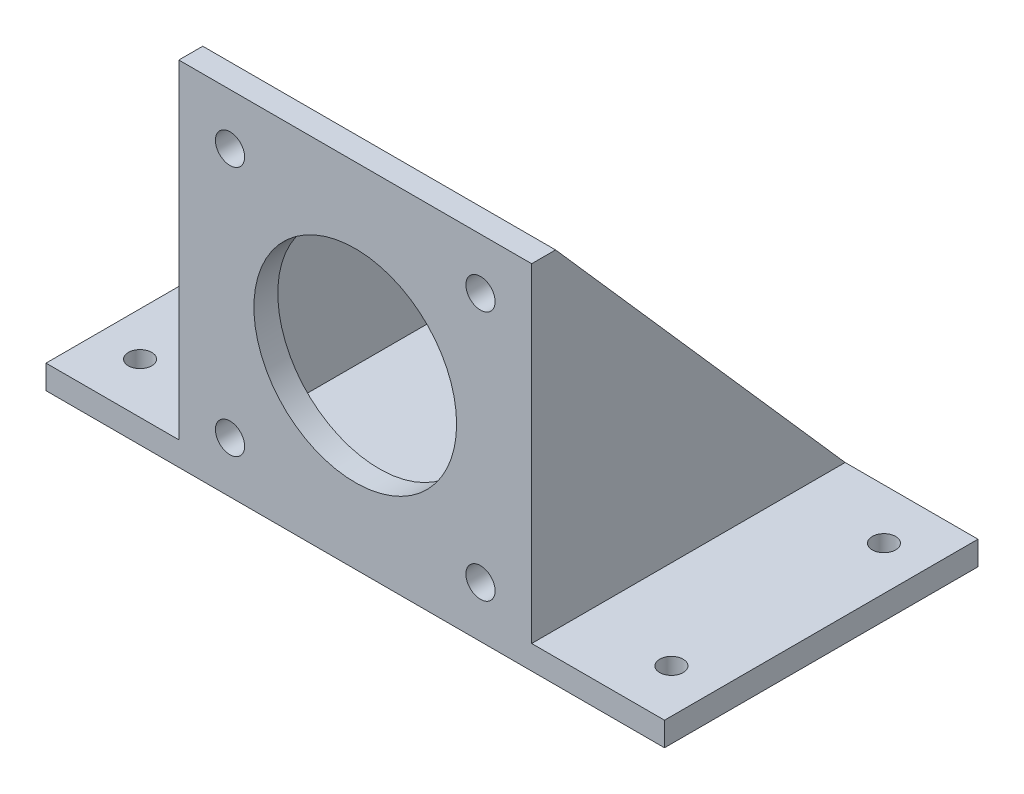
ISO-10303-21;
HEADER;
FILE_DESCRIPTION(('STEP AP214'),'2;1');
FILE_NAME('part.step','',(''),(''),'','','');
FILE_SCHEMA(('AUTOMOTIVE_DESIGN { 1 0 10303 214 1 1 1 1 }'));
ENDSEC;
DATA;
#1=APPLICATION_CONTEXT('core data for automotive mechanical design processes');
#2=APPLICATION_PROTOCOL_DEFINITION('international standard','automotive_design',2000,#1);
#3=PRODUCT_CONTEXT('',#1,'mechanical');
#4=PRODUCT('Part','Part','',(#3));
#5=PRODUCT_RELATED_PRODUCT_CATEGORY('part','',(#4));
#6=PRODUCT_DEFINITION_FORMATION('','',#4);
#7=PRODUCT_DEFINITION_CONTEXT('part definition',#1,'design');
#8=PRODUCT_DEFINITION('design','',#6,#7);
#9=PRODUCT_DEFINITION_SHAPE('','',#8);
#10=(LENGTH_UNIT() NAMED_UNIT(*) SI_UNIT(.MILLI.,.METRE.));
#11=(NAMED_UNIT(*) PLANE_ANGLE_UNIT() SI_UNIT($,.RADIAN.));
#12=(NAMED_UNIT(*) SI_UNIT($,.STERADIAN.) SOLID_ANGLE_UNIT());
#13=UNCERTAINTY_MEASURE_WITH_UNIT(LENGTH_MEASURE(1.E-05),#10,'distance_accuracy_value','');
#14=(GEOMETRIC_REPRESENTATION_CONTEXT(3) GLOBAL_UNCERTAINTY_ASSIGNED_CONTEXT((#13)) GLOBAL_UNIT_ASSIGNED_CONTEXT((#10,
#11,#12)) REPRESENTATION_CONTEXT('',''));
#15=CARTESIAN_POINT('',(0.,0.,0.));
#16=DIRECTION('',(0.,0.,1.));
#17=DIRECTION('',(1.,0.,0.));
#18=AXIS2_PLACEMENT_3D('',#15,#16,#17);
#19=CARTESIAN_POINT('',(0.,0.,59.));
#20=DIRECTION('',(1.,0.,0.));
#21=DIRECTION('',(0.,0.,-1.));
#22=AXIS2_PLACEMENT_3D('',#19,#20,#21);
#23=PLANE('',#22);
#24=DIRECTION('',(0.,-0.750545118423435,-0.66081920765876));
#25=VECTOR('',#24,1.);
#26=CARTESIAN_POINT('',(0.,66.4,54.5));
#27=LINE('',#26,#25);
#28=CARTESIAN_POINT('',(0.,66.4,54.5));
#29=VERTEX_POINT('',#28);
#30=CARTESIAN_POINT('',(0.,4.5,0.));
#31=VERTEX_POINT('',#30);
#32=EDGE_CURVE('E169',#29,#31,#27,.T.);
#33=ORIENTED_EDGE('',*,*,#32,.T.);
#34=DIRECTION('',(0.,0.,1.));
#35=VECTOR('',#34,1.);
#36=CARTESIAN_POINT('',(0.,4.5,59.));
#37=LINE('',#36,#35);
#38=CARTESIAN_POINT('',(0.,4.5,59.));
#39=VERTEX_POINT('',#38);
#40=EDGE_CURVE('E165',#31,#39,#37,.T.);
#41=ORIENTED_EDGE('',*,*,#40,.T.);
#42=DIRECTION('',(0.,-1.,0.));
#43=VECTOR('',#42,1.);
#44=CARTESIAN_POINT('',(0.,0.,59.));
#45=LINE('',#44,#43);
#46=CARTESIAN_POINT('',(0.,66.4,59.));
#47=VERTEX_POINT('',#46);
#48=EDGE_CURVE('E233',#47,#39,#45,.T.);
#49=ORIENTED_EDGE('',*,*,#48,.F.);
#50=DIRECTION('',(0.,0.,-1.));
#51=VECTOR('',#50,1.);
#52=CARTESIAN_POINT('',(0.,66.4,59.));
#53=LINE('',#52,#51);
#54=EDGE_CURVE('E40',#47,#29,#53,.T.);
#55=ORIENTED_EDGE('',*,*,#54,.T.);
#56=EDGE_LOOP('',(#33,#41,#49,#55));
#57=FACE_BOUND('',#56,.T.);
#58=ADVANCED_FACE('F32',(#57),#23,.F.);
#59=CARTESIAN_POINT('',(0.,0.,59.));
#60=DIRECTION('',(0.,1.,0.));
#61=DIRECTION('',(0.,0.,1.));
#62=AXIS2_PLACEMENT_3D('',#59,#60,#61);
#63=PLANE('',#62);
#64=CARTESIAN_POINT('',(83.2,0.,9.49999999999998));
#65=DIRECTION('',(0.,1.,0.));
#66=DIRECTION('',(0.,0.,1.));
#67=AXIS2_PLACEMENT_3D('',#64,#65,#66);
#68=CIRCLE('',#67,2.2);
#69=CARTESIAN_POINT('',(83.2,0.,11.7));
#70=VERTEX_POINT('',#69);
#71=EDGE_CURVE('E462',#70,#70,#68,.T.);
#72=ORIENTED_EDGE('',*,*,#71,.T.);
#73=EDGE_LOOP('',(#72));
#74=FACE_BOUND('',#73,.T.);
#75=CARTESIAN_POINT('',(83.2,0.,49.5));
#76=DIRECTION('',(0.,1.,0.));
#77=DIRECTION('',(0.,0.,1.));
#78=AXIS2_PLACEMENT_3D('',#75,#76,#77);
#79=CIRCLE('',#78,2.2);
#80=CARTESIAN_POINT('',(83.2,0.,51.7));
#81=VERTEX_POINT('',#80);
#82=EDGE_CURVE('E470',#81,#81,#79,.T.);
#83=ORIENTED_EDGE('',*,*,#82,.T.);
#84=EDGE_LOOP('',(#83));
#85=FACE_BOUND('',#84,.T.);
#86=CARTESIAN_POINT('',(-16.8,0.,49.5));
#87=DIRECTION('',(0.,1.,0.));
#88=DIRECTION('',(0.,0.,1.));
#89=AXIS2_PLACEMENT_3D('',#86,#87,#88);
#90=CIRCLE('',#89,2.2);
#91=CARTESIAN_POINT('',(-16.8,0.,51.7));
#92=VERTEX_POINT('',#91);
#93=EDGE_CURVE('E476',#92,#92,#90,.T.);
#94=ORIENTED_EDGE('',*,*,#93,.T.);
#95=EDGE_LOOP('',(#94));
#96=FACE_BOUND('',#95,.T.);
#97=CARTESIAN_POINT('',(-16.8,0.,9.49999999999998));
#98=DIRECTION('',(0.,1.,0.));
#99=DIRECTION('',(0.,0.,1.));
#100=AXIS2_PLACEMENT_3D('',#97,#98,#99);
#101=CIRCLE('',#100,2.2);
#102=CARTESIAN_POINT('',(-16.8,0.,11.7));
#103=VERTEX_POINT('',#102);
#104=EDGE_CURVE('E157',#103,#103,#101,.T.);
#105=ORIENTED_EDGE('',*,*,#104,.T.);
#106=EDGE_LOOP('',(#105));
#107=FACE_BOUND('',#106,.T.);
#108=DIRECTION('',(1.,0.,0.));
#109=VECTOR('',#108,1.);
#110=CARTESIAN_POINT('',(0.,0.,0.));
#111=LINE('',#110,#109);
#112=CARTESIAN_POINT('',(-25.,0.,0.));
#113=VERTEX_POINT('',#112);
#114=CARTESIAN_POINT('',(91.4,0.,0.));
#115=VERTEX_POINT('',#114);
#116=EDGE_CURVE('E232',#113,#115,#111,.T.);
#117=ORIENTED_EDGE('',*,*,#116,.T.);
#118=DIRECTION('',(0.,0.,1.));
#119=VECTOR('',#118,1.);
#120=CARTESIAN_POINT('',(91.4,0.,59.));
#121=LINE('',#120,#119);
#122=CARTESIAN_POINT('',(91.4,0.,59.));
#123=VERTEX_POINT('',#122);
#124=EDGE_CURVE('E146',#115,#123,#121,.T.);
#125=ORIENTED_EDGE('',*,*,#124,.T.);
#126=DIRECTION('',(1.,0.,0.));
#127=VECTOR('',#126,1.);
#128=CARTESIAN_POINT('',(0.,0.,59.));
#129=LINE('',#128,#127);
#130=CARTESIAN_POINT('',(-25.,0.,59.));
#131=VERTEX_POINT('',#130);
#132=EDGE_CURVE('E122',#131,#123,#129,.T.);
#133=ORIENTED_EDGE('',*,*,#132,.F.);
#134=DIRECTION('',(0.,0.,-1.));
#135=VECTOR('',#134,1.);
#136=CARTESIAN_POINT('',(-25.,0.,59.));
#137=LINE('',#136,#135);
#138=EDGE_CURVE('E143',#131,#113,#137,.T.);
#139=ORIENTED_EDGE('',*,*,#138,.T.);
#140=EDGE_LOOP('',(#117,#125,#133,#139));
#141=FACE_BOUND('',#140,.T.);
#142=ADVANCED_FACE('F285',(#74,#85,#96,#107,#141),#63,.F.);
#143=CARTESIAN_POINT('',(66.4,0.,59.));
#144=DIRECTION('',(-1.,0.,0.));
#145=DIRECTION('',(0.,-1.,0.));
#146=AXIS2_PLACEMENT_3D('',#143,#144,#145);
#147=PLANE('',#146);
#148=DIRECTION('',(0.,1.,0.));
#149=VECTOR('',#148,1.);
#150=CARTESIAN_POINT('',(66.4,0.,59.));
#151=LINE('',#150,#149);
#152=CARTESIAN_POINT('',(66.4,4.5,59.));
#153=VERTEX_POINT('',#152);
#154=CARTESIAN_POINT('',(66.4,66.4,59.));
#155=VERTEX_POINT('',#154);
#156=EDGE_CURVE('E47',#153,#155,#151,.T.);
#157=ORIENTED_EDGE('',*,*,#156,.F.);
#158=DIRECTION('',(0.,0.,-1.));
#159=VECTOR('',#158,1.);
#160=CARTESIAN_POINT('',(66.4,4.5,59.));
#161=LINE('',#160,#159);
#162=CARTESIAN_POINT('',(66.4,4.50000000000002,0.));
#163=VERTEX_POINT('',#162);
#164=EDGE_CURVE('E135',#153,#163,#161,.T.);
#165=ORIENTED_EDGE('',*,*,#164,.T.);
#166=DIRECTION('',(0.,-0.750545118423435,-0.66081920765876));
#167=VECTOR('',#166,1.);
#168=CARTESIAN_POINT('',(66.4,66.4,54.5));
#169=LINE('',#168,#167);
#170=CARTESIAN_POINT('',(66.4,66.4,54.5));
#171=VERTEX_POINT('',#170);
#172=EDGE_CURVE('E168',#171,#163,#169,.T.);
#173=ORIENTED_EDGE('',*,*,#172,.F.);
#174=DIRECTION('',(0.,0.,-1.));
#175=VECTOR('',#174,1.);
#176=CARTESIAN_POINT('',(66.4,66.4,59.));
#177=LINE('',#176,#175);
#178=EDGE_CURVE('E11',#155,#171,#177,.T.);
#179=ORIENTED_EDGE('',*,*,#178,.F.);
#180=EDGE_LOOP('',(#157,#165,#173,#179));
#181=FACE_BOUND('',#180,.T.);
#182=ADVANCED_FACE('F272',(#181),#147,.F.);
#183=CARTESIAN_POINT('',(0.,66.4,59.));
#184=DIRECTION('',(0.,-1.,0.));
#185=DIRECTION('',(1.,0.,0.));
#186=AXIS2_PLACEMENT_3D('',#183,#184,#185);
#187=PLANE('',#186);
#188=ORIENTED_EDGE('',*,*,#178,.T.);
#189=DIRECTION('',(1.,0.,0.));
#190=VECTOR('',#189,1.);
#191=CARTESIAN_POINT('',(0.,66.4,54.5));
#192=LINE('',#191,#190);
#193=CARTESIAN_POINT('',(61.9,66.4,54.5));
#194=VERTEX_POINT('',#193);
#195=EDGE_CURVE('E176',#194,#171,#192,.T.);
#196=ORIENTED_EDGE('',*,*,#195,.F.);
#197=DIRECTION('',(1.,0.,0.));
#198=VECTOR('',#197,1.);
#199=CARTESIAN_POINT('',(61.9,66.4,54.5));
#200=LINE('',#199,#198);
#201=CARTESIAN_POINT('',(4.5,66.4,54.5));
#202=VERTEX_POINT('',#201);
#203=EDGE_CURVE('E184',#202,#194,#200,.T.);
#204=ORIENTED_EDGE('',*,*,#203,.F.);
#205=EDGE_CURVE('E173',#29,#202,#192,.T.);
#206=ORIENTED_EDGE('',*,*,#205,.F.);
#207=ORIENTED_EDGE('',*,*,#54,.F.);
#208=DIRECTION('',(-1.,0.,0.));
#209=VECTOR('',#208,1.);
#210=CARTESIAN_POINT('',(0.,66.4,59.));
#211=LINE('',#210,#209);
#212=EDGE_CURVE('E237',#155,#47,#211,.T.);
#213=ORIENTED_EDGE('',*,*,#212,.F.);
#214=EDGE_LOOP('',(#188,#196,#204,#206,#207,#213));
#215=FACE_BOUND('',#214,.T.);
#216=ADVANCED_FACE('F247',(#215),#187,.F.);
#217=CARTESIAN_POINT('',(0.,0.,59.));
#218=DIRECTION('',(0.,0.,-1.));
#219=DIRECTION('',(-1.,0.,0.));
#220=AXIS2_PLACEMENT_3D('',#217,#218,#219);
#221=PLANE('',#220);
#222=CARTESIAN_POINT('',(9.62999999999999,9.63,59.));
#223=DIRECTION('',(0.,0.,1.));
#224=DIRECTION('',(1.,0.,0.));
#225=AXIS2_PLACEMENT_3D('',#222,#223,#224);
#226=CIRCLE('',#225,2.75);
#227=CARTESIAN_POINT('',(12.38,9.63,59.));
#228=VERTEX_POINT('',#227);
#229=EDGE_CURVE('E217',#228,#228,#226,.T.);
#230=ORIENTED_EDGE('',*,*,#229,.F.);
#231=EDGE_LOOP('',(#230));
#232=FACE_BOUND('',#231,.T.);
#233=CARTESIAN_POINT('',(56.77,9.63,59.));
#234=DIRECTION('',(0.,0.,1.));
#235=DIRECTION('',(1.,0.,0.));
#236=AXIS2_PLACEMENT_3D('',#233,#234,#235);
#237=CIRCLE('',#236,2.75);
#238=CARTESIAN_POINT('',(59.52,9.63,59.));
#239=VERTEX_POINT('',#238);
#240=EDGE_CURVE('E220',#239,#239,#237,.T.);
#241=ORIENTED_EDGE('',*,*,#240,.F.);
#242=EDGE_LOOP('',(#241));
#243=FACE_BOUND('',#242,.T.);
#244=CARTESIAN_POINT('',(56.77,56.77,59.));
#245=DIRECTION('',(0.,0.,1.));
#246=DIRECTION('',(1.,0.,0.));
#247=AXIS2_PLACEMENT_3D('',#244,#245,#246);
#248=CIRCLE('',#247,2.75);
#249=CARTESIAN_POINT('',(59.52,56.77,59.));
#250=VERTEX_POINT('',#249);
#251=EDGE_CURVE('E223',#250,#250,#248,.T.);
#252=ORIENTED_EDGE('',*,*,#251,.F.);
#253=EDGE_LOOP('',(#252));
#254=FACE_BOUND('',#253,.T.);
#255=CARTESIAN_POINT('',(9.62999999999999,56.77,59.));
#256=DIRECTION('',(0.,0.,1.));
#257=DIRECTION('',(1.,0.,0.));
#258=AXIS2_PLACEMENT_3D('',#255,#256,#257);
#259=CIRCLE('',#258,2.75);
#260=CARTESIAN_POINT('',(12.38,56.77,59.));
#261=VERTEX_POINT('',#260);
#262=EDGE_CURVE('E226',#261,#261,#259,.T.);
#263=ORIENTED_EDGE('',*,*,#262,.F.);
#264=EDGE_LOOP('',(#263));
#265=FACE_BOUND('',#264,.T.);
#266=CARTESIAN_POINT('',(33.2,33.2,59.));
#267=DIRECTION('',(0.,0.,1.));
#268=DIRECTION('',(1.,0.,0.));
#269=AXIS2_PLACEMENT_3D('',#266,#267,#268);
#270=CIRCLE('',#269,19.075);
#271=CARTESIAN_POINT('',(52.275,33.2,59.));
#272=VERTEX_POINT('',#271);
#273=EDGE_CURVE('E229',#272,#272,#270,.T.);
#274=ORIENTED_EDGE('',*,*,#273,.F.);
#275=EDGE_LOOP('',(#274));
#276=FACE_BOUND('',#275,.T.);
#277=ORIENTED_EDGE('',*,*,#48,.T.);
#278=DIRECTION('',(-1.,0.,0.));
#279=VECTOR('',#278,1.);
#280=CARTESIAN_POINT('',(91.4,4.5,59.));
#281=LINE('',#280,#279);
#282=CARTESIAN_POINT('',(-25.,4.5,59.));
#283=VERTEX_POINT('',#282);
#284=EDGE_CURVE('E137',#39,#283,#281,.T.);
#285=ORIENTED_EDGE('',*,*,#284,.T.);
#286=DIRECTION('',(0.,-1.,0.));
#287=VECTOR('',#286,1.);
#288=CARTESIAN_POINT('',(-25.,4.5,59.));
#289=LINE('',#288,#287);
#290=EDGE_CURVE('E127',#283,#131,#289,.T.);
#291=ORIENTED_EDGE('',*,*,#290,.T.);
#292=ORIENTED_EDGE('',*,*,#132,.T.);
#293=DIRECTION('',(0.,-1.,0.));
#294=VECTOR('',#293,1.);
#295=CARTESIAN_POINT('',(91.4,4.5,59.));
#296=LINE('',#295,#294);
#297=CARTESIAN_POINT('',(91.4,4.5,59.));
#298=VERTEX_POINT('',#297);
#299=EDGE_CURVE('E116',#298,#123,#296,.T.);
#300=ORIENTED_EDGE('',*,*,#299,.F.);
#301=EDGE_CURVE('E120',#298,#153,#281,.T.);
#302=ORIENTED_EDGE('',*,*,#301,.T.);
#303=ORIENTED_EDGE('',*,*,#156,.T.);
#304=ORIENTED_EDGE('',*,*,#212,.T.);
#305=EDGE_LOOP('',(#277,#285,#291,#292,#300,#302,#303,#304));
#306=FACE_BOUND('',#305,.T.);
#307=ADVANCED_FACE('F119',(#232,#243,#254,#265,#276,#306),#221,.F.);
#308=CARTESIAN_POINT('',(0.,0.,0.));
#309=DIRECTION('',(0.,0.,-1.));
#310=DIRECTION('',(-1.,0.,0.));
#311=AXIS2_PLACEMENT_3D('',#308,#309,#310);
#312=PLANE('',#311);
#313=DIRECTION('',(1.,0.,0.));
#314=VECTOR('',#313,1.);
#315=CARTESIAN_POINT('',(0.,4.50000000000001,0.));
#316=LINE('',#315,#314);
#317=CARTESIAN_POINT('',(61.9,4.50000000000002,0.));
#318=VERTEX_POINT('',#317);
#319=EDGE_CURVE('E55',#318,#163,#316,.T.);
#320=ORIENTED_EDGE('',*,*,#319,.T.);
#321=DIRECTION('',(1.,0.,0.));
#322=VECTOR('',#321,1.);
#323=CARTESIAN_POINT('',(91.4,4.5,0.));
#324=LINE('',#323,#322);
#325=CARTESIAN_POINT('',(91.4,4.5,0.));
#326=VERTEX_POINT('',#325);
#327=EDGE_CURVE('E154',#163,#326,#324,.T.);
#328=ORIENTED_EDGE('',*,*,#327,.T.);
#329=DIRECTION('',(0.,-1.,0.));
#330=VECTOR('',#329,1.);
#331=CARTESIAN_POINT('',(91.4,4.5,0.));
#332=LINE('',#331,#330);
#333=EDGE_CURVE('E142',#326,#115,#332,.T.);
#334=ORIENTED_EDGE('',*,*,#333,.T.);
#335=ORIENTED_EDGE('',*,*,#116,.F.);
#336=DIRECTION('',(0.,-1.,0.));
#337=VECTOR('',#336,1.);
#338=CARTESIAN_POINT('',(-25.,4.5,0.));
#339=LINE('',#338,#337);
#340=CARTESIAN_POINT('',(-25.,4.5,0.));
#341=VERTEX_POINT('',#340);
#342=EDGE_CURVE('E160',#341,#113,#339,.T.);
#343=ORIENTED_EDGE('',*,*,#342,.F.);
#344=EDGE_CURVE('E128',#341,#31,#324,.T.);
#345=ORIENTED_EDGE('',*,*,#344,.T.);
#346=CARTESIAN_POINT('',(4.50000000000001,4.50000000000001,0.));
#347=VERTEX_POINT('',#346);
#348=EDGE_CURVE('E177',#31,#347,#316,.T.);
#349=ORIENTED_EDGE('',*,*,#348,.T.);
#350=DIRECTION('',(-1.,0.,0.));
#351=VECTOR('',#350,1.);
#352=CARTESIAN_POINT('',(4.50000000000001,4.5,0.));
#353=LINE('',#352,#351);
#354=EDGE_CURVE('E191',#318,#347,#353,.T.);
#355=ORIENTED_EDGE('',*,*,#354,.F.);
#356=EDGE_LOOP('',(#320,#328,#334,#335,#343,#345,#349,#355));
#357=FACE_BOUND('',#356,.T.);
#358=ADVANCED_FACE('F265',(#357),#312,.T.);
#359=CARTESIAN_POINT('',(33.2,33.2,0.));
#360=DIRECTION('',(0.,0.,1.));
#361=DIRECTION('',(1.,0.,0.));
#362=AXIS2_PLACEMENT_3D('',#359,#360,#361);
#363=CYLINDRICAL_SURFACE('',#362,19.075);
#364=CARTESIAN_POINT('',(33.2,33.2,54.5));
#365=DIRECTION('',(0.,0.,1.));
#366=DIRECTION('',(1.,0.,0.));
#367=AXIS2_PLACEMENT_3D('',#364,#365,#366);
#368=CIRCLE('',#367,19.075);
#369=CARTESIAN_POINT('',(52.275,33.2,54.5));
#370=VERTEX_POINT('',#369);
#371=EDGE_CURVE('E214',#370,#370,#368,.F.);
#372=ORIENTED_EDGE('',*,*,#371,.T.);
#373=EDGE_LOOP('',(#372));
#374=FACE_BOUND('',#373,.T.);
#375=ORIENTED_EDGE('',*,*,#273,.T.);
#376=EDGE_LOOP('',(#375));
#377=FACE_BOUND('',#376,.T.);
#378=ADVANCED_FACE('F301',(#374,#377),#363,.F.);
#379=CARTESIAN_POINT('',(9.62999999999999,56.77,0.));
#380=DIRECTION('',(0.,0.,1.));
#381=DIRECTION('',(1.,0.,0.));
#382=AXIS2_PLACEMENT_3D('',#379,#380,#381);
#383=CYLINDRICAL_SURFACE('',#382,2.75);
#384=CARTESIAN_POINT('',(9.62999999999999,56.77,54.5));
#385=DIRECTION('',(0.,0.,1.));
#386=DIRECTION('',(1.,0.,0.));
#387=AXIS2_PLACEMENT_3D('',#384,#385,#386);
#388=CIRCLE('',#387,2.75);
#389=CARTESIAN_POINT('',(12.38,56.77,54.5));
#390=VERTEX_POINT('',#389);
#391=EDGE_CURVE('E211',#390,#390,#388,.F.);
#392=ORIENTED_EDGE('',*,*,#391,.T.);
#393=EDGE_LOOP('',(#392));
#394=FACE_BOUND('',#393,.T.);
#395=ORIENTED_EDGE('',*,*,#262,.T.);
#396=EDGE_LOOP('',(#395));
#397=FACE_BOUND('',#396,.T.);
#398=ADVANCED_FACE('F307',(#394,#397),#383,.F.);
#399=CARTESIAN_POINT('',(56.77,56.77,0.));
#400=DIRECTION('',(0.,0.,1.));
#401=DIRECTION('',(1.,0.,0.));
#402=AXIS2_PLACEMENT_3D('',#399,#400,#401);
#403=CYLINDRICAL_SURFACE('',#402,2.75);
#404=CARTESIAN_POINT('',(56.77,56.77,54.5));
#405=DIRECTION('',(0.,0.,1.));
#406=DIRECTION('',(1.,0.,0.));
#407=AXIS2_PLACEMENT_3D('',#404,#405,#406);
#408=CIRCLE('',#407,2.75);
#409=CARTESIAN_POINT('',(59.52,56.77,54.5));
#410=VERTEX_POINT('',#409);
#411=EDGE_CURVE('E208',#410,#410,#408,.F.);
#412=ORIENTED_EDGE('',*,*,#411,.T.);
#413=EDGE_LOOP('',(#412));
#414=FACE_BOUND('',#413,.T.);
#415=ORIENTED_EDGE('',*,*,#251,.T.);
#416=EDGE_LOOP('',(#415));
#417=FACE_BOUND('',#416,.T.);
#418=ADVANCED_FACE('F311',(#414,#417),#403,.F.);
#419=CARTESIAN_POINT('',(56.77,9.63,0.));
#420=DIRECTION('',(0.,0.,1.));
#421=DIRECTION('',(1.,0.,0.));
#422=AXIS2_PLACEMENT_3D('',#419,#420,#421);
#423=CYLINDRICAL_SURFACE('',#422,2.75);
#424=CARTESIAN_POINT('',(56.77,9.63,54.5));
#425=DIRECTION('',(0.,0.,1.));
#426=DIRECTION('',(1.,0.,0.));
#427=AXIS2_PLACEMENT_3D('',#424,#425,#426);
#428=CIRCLE('',#427,2.75);
#429=CARTESIAN_POINT('',(59.52,9.63,54.5));
#430=VERTEX_POINT('',#429);
#431=EDGE_CURVE('E205',#430,#430,#428,.F.);
#432=ORIENTED_EDGE('',*,*,#431,.T.);
#433=EDGE_LOOP('',(#432));
#434=FACE_BOUND('',#433,.T.);
#435=ORIENTED_EDGE('',*,*,#240,.T.);
#436=EDGE_LOOP('',(#435));
#437=FACE_BOUND('',#436,.T.);
#438=ADVANCED_FACE('F315',(#434,#437),#423,.F.);
#439=CARTESIAN_POINT('',(9.62999999999999,9.63,0.));
#440=DIRECTION('',(0.,0.,1.));
#441=DIRECTION('',(1.,0.,0.));
#442=AXIS2_PLACEMENT_3D('',#439,#440,#441);
#443=CYLINDRICAL_SURFACE('',#442,2.75);
#444=CARTESIAN_POINT('',(9.62999999999999,9.63,54.5));
#445=DIRECTION('',(0.,0.,1.));
#446=DIRECTION('',(1.,0.,0.));
#447=AXIS2_PLACEMENT_3D('',#444,#445,#446);
#448=CIRCLE('',#447,2.75);
#449=CARTESIAN_POINT('',(12.38,9.63,54.5));
#450=VERTEX_POINT('',#449);
#451=EDGE_CURVE('E35',#450,#450,#448,.F.);
#452=ORIENTED_EDGE('',*,*,#451,.T.);
#453=EDGE_LOOP('',(#452));
#454=FACE_BOUND('',#453,.T.);
#455=ORIENTED_EDGE('',*,*,#229,.T.);
#456=EDGE_LOOP('',(#455));
#457=FACE_BOUND('',#456,.T.);
#458=ADVANCED_FACE('F319',(#454,#457),#443,.F.);
#459=CARTESIAN_POINT('',(61.9,4.50000000000002,54.5));
#460=DIRECTION('',(0.,0.,1.));
#461=DIRECTION('',(1.,0.,0.));
#462=AXIS2_PLACEMENT_3D('',#459,#460,#461);
#463=PLANE('',#462);
#464=ORIENTED_EDGE('',*,*,#391,.F.);
#465=EDGE_LOOP('',(#464));
#466=FACE_BOUND('',#465,.T.);
#467=ORIENTED_EDGE('',*,*,#431,.F.);
#468=EDGE_LOOP('',(#467));
#469=FACE_BOUND('',#468,.T.);
#470=ORIENTED_EDGE('',*,*,#203,.T.);
#471=DIRECTION('',(0.,1.,0.));
#472=VECTOR('',#471,1.);
#473=CARTESIAN_POINT('',(61.9,4.50000000000002,54.5));
#474=LINE('',#473,#472);
#475=CARTESIAN_POINT('',(61.9,4.50000000000002,54.5));
#476=VERTEX_POINT('',#475);
#477=EDGE_CURVE('E197',#476,#194,#474,.T.);
#478=ORIENTED_EDGE('',*,*,#477,.F.);
#479=DIRECTION('',(1.,0.,0.));
#480=VECTOR('',#479,1.);
#481=CARTESIAN_POINT('',(61.9,4.50000000000002,54.5));
#482=LINE('',#481,#480);
#483=CARTESIAN_POINT('',(4.50000000000001,4.5,54.5));
#484=VERTEX_POINT('',#483);
#485=EDGE_CURVE('E185',#484,#476,#482,.T.);
#486=ORIENTED_EDGE('',*,*,#485,.F.);
#487=DIRECTION('',(0.,1.,0.));
#488=VECTOR('',#487,1.);
#489=CARTESIAN_POINT('',(4.50000000000001,4.5,54.5));
#490=LINE('',#489,#488);
#491=EDGE_CURVE('E200',#484,#202,#490,.T.);
#492=ORIENTED_EDGE('',*,*,#491,.T.);
#493=EDGE_LOOP('',(#470,#478,#486,#492));
#494=FACE_BOUND('',#493,.T.);
#495=ORIENTED_EDGE('',*,*,#451,.F.);
#496=EDGE_LOOP('',(#495));
#497=FACE_BOUND('',#496,.T.);
#498=ORIENTED_EDGE('',*,*,#411,.F.);
#499=EDGE_LOOP('',(#498));
#500=FACE_BOUND('',#499,.T.);
#501=ORIENTED_EDGE('',*,*,#371,.F.);
#502=EDGE_LOOP('',(#501));
#503=FACE_BOUND('',#502,.T.);
#504=ADVANCED_FACE('F258',(#466,#469,#494,#497,#500,#503),#463,.F.);
#505=CARTESIAN_POINT('',(4.50000000000001,4.5,54.5));
#506=DIRECTION('',(-1.,0.,0.));
#507=DIRECTION('',(0.,-1.,0.));
#508=AXIS2_PLACEMENT_3D('',#505,#506,#507);
#509=PLANE('',#508);
#510=DIRECTION('',(0.,0.,1.));
#511=VECTOR('',#510,1.);
#512=CARTESIAN_POINT('',(4.50000000000001,4.5,54.5));
#513=LINE('',#512,#511);
#514=EDGE_CURVE('E194',#347,#484,#513,.T.);
#515=ORIENTED_EDGE('',*,*,#514,.F.);
#516=DIRECTION('',(0.,0.750545118423436,0.66081920765876));
#517=VECTOR('',#516,1.);
#518=CARTESIAN_POINT('',(4.50000000000001,31.5306173605455,23.7991703739859));
#519=LINE('',#518,#517);
#520=EDGE_CURVE('E181',#347,#202,#519,.T.);
#521=ORIENTED_EDGE('',*,*,#520,.T.);
#522=ORIENTED_EDGE('',*,*,#491,.F.);
#523=EDGE_LOOP('',(#515,#521,#522));
#524=FACE_BOUND('',#523,.T.);
#525=ADVANCED_FACE('F255',(#524),#509,.F.);
#526=CARTESIAN_POINT('',(61.9,4.50000000000002,54.5));
#527=DIRECTION('',(1.,0.,0.));
#528=DIRECTION('',(0.,1.,0.));
#529=AXIS2_PLACEMENT_3D('',#526,#527,#528);
#530=PLANE('',#529);
#531=ORIENTED_EDGE('',*,*,#477,.T.);
#532=DIRECTION('',(0.,-0.750545118423436,-0.66081920765876));
#533=VECTOR('',#532,1.);
#534=CARTESIAN_POINT('',(61.9,31.5306173605455,23.7991703739859));
#535=LINE('',#534,#533);
#536=EDGE_CURVE('E175',#194,#318,#535,.T.);
#537=ORIENTED_EDGE('',*,*,#536,.T.);
#538=DIRECTION('',(0.,0.,-1.));
#539=VECTOR('',#538,1.);
#540=CARTESIAN_POINT('',(61.9,4.50000000000002,54.5));
#541=LINE('',#540,#539);
#542=EDGE_CURVE('E188',#476,#318,#541,.T.);
#543=ORIENTED_EDGE('',*,*,#542,.F.);
#544=EDGE_LOOP('',(#531,#537,#543));
#545=FACE_BOUND('',#544,.T.);
#546=ADVANCED_FACE('F274',(#545),#530,.F.);
#547=CARTESIAN_POINT('',(0.,4.5,0.));
#548=DIRECTION('',(0.,-1.,0.));
#549=DIRECTION('',(1.,0.,0.));
#550=AXIS2_PLACEMENT_3D('',#547,#548,#549);
#551=PLANE('',#550);
#552=ORIENTED_EDGE('',*,*,#485,.T.);
#553=ORIENTED_EDGE('',*,*,#542,.T.);
#554=ORIENTED_EDGE('',*,*,#354,.T.);
#555=ORIENTED_EDGE('',*,*,#514,.T.);
#556=EDGE_LOOP('',(#552,#553,#554,#555));
#557=FACE_BOUND('',#556,.T.);
#558=ADVANCED_FACE('F262',(#557),#551,.F.);
#559=CARTESIAN_POINT('',(0.,66.4,54.5));
#560=DIRECTION('',(0.,-0.66081920765876,0.750545118423436));
#561=DIRECTION('',(0.,-0.750545118423436,-0.66081920765876));
#562=AXIS2_PLACEMENT_3D('',#559,#560,#561);
#563=PLANE('',#562);
#564=ORIENTED_EDGE('',*,*,#195,.T.);
#565=ORIENTED_EDGE('',*,*,#172,.T.);
#566=ORIENTED_EDGE('',*,*,#319,.F.);
#567=ORIENTED_EDGE('',*,*,#536,.F.);
#568=EDGE_LOOP('',(#564,#565,#566,#567));
#569=FACE_BOUND('',#568,.T.);
#570=ADVANCED_FACE('F275',(#569),#563,.F.);
#571=ORIENTED_EDGE('',*,*,#348,.F.);
#572=ORIENTED_EDGE('',*,*,#32,.F.);
#573=ORIENTED_EDGE('',*,*,#205,.T.);
#574=ORIENTED_EDGE('',*,*,#520,.F.);
#575=EDGE_LOOP('',(#571,#572,#573,#574));
#576=FACE_BOUND('',#575,.T.);
#577=ADVANCED_FACE('F252',(#576),#563,.F.);
#578=CARTESIAN_POINT('',(91.4,4.5,59.));
#579=DIRECTION('',(1.,0.,0.));
#580=DIRECTION('',(0.,0.,-1.));
#581=AXIS2_PLACEMENT_3D('',#578,#579,#580);
#582=PLANE('',#581);
#583=ORIENTED_EDGE('',*,*,#124,.F.);
#584=ORIENTED_EDGE('',*,*,#333,.F.);
#585=DIRECTION('',(0.,0.,1.));
#586=VECTOR('',#585,1.);
#587=CARTESIAN_POINT('',(91.4,4.5,59.));
#588=LINE('',#587,#586);
#589=EDGE_CURVE('E134',#326,#298,#588,.T.);
#590=ORIENTED_EDGE('',*,*,#589,.T.);
#591=ORIENTED_EDGE('',*,*,#299,.T.);
#592=EDGE_LOOP('',(#583,#584,#590,#591));
#593=FACE_BOUND('',#592,.T.);
#594=ADVANCED_FACE('F140',(#593),#582,.T.);
#595=CARTESIAN_POINT('',(0.,4.5,0.));
#596=DIRECTION('',(0.,1.,0.));
#597=DIRECTION('',(0.,0.,1.));
#598=AXIS2_PLACEMENT_3D('',#595,#596,#597);
#599=PLANE('',#598);
#600=CARTESIAN_POINT('',(83.2,4.5,9.49999999999998));
#601=DIRECTION('',(0.,1.,0.));
#602=DIRECTION('',(0.,0.,1.));
#603=AXIS2_PLACEMENT_3D('',#600,#601,#602);
#604=CIRCLE('',#603,2.2);
#605=CARTESIAN_POINT('',(83.2,4.5,11.7));
#606=VERTEX_POINT('',#605);
#607=EDGE_CURVE('E465',#606,#606,#604,.T.);
#608=ORIENTED_EDGE('',*,*,#607,.F.);
#609=EDGE_LOOP('',(#608));
#610=FACE_BOUND('',#609,.T.);
#611=CARTESIAN_POINT('',(83.2,4.5,49.5));
#612=DIRECTION('',(0.,1.,0.));
#613=DIRECTION('',(0.,0.,1.));
#614=AXIS2_PLACEMENT_3D('',#611,#612,#613);
#615=CIRCLE('',#614,2.2);
#616=CARTESIAN_POINT('',(83.2,4.5,51.7));
#617=VERTEX_POINT('',#616);
#618=EDGE_CURVE('E467',#617,#617,#615,.T.);
#619=ORIENTED_EDGE('',*,*,#618,.F.);
#620=EDGE_LOOP('',(#619));
#621=FACE_BOUND('',#620,.T.);
#622=ORIENTED_EDGE('',*,*,#164,.F.);
#623=ORIENTED_EDGE('',*,*,#301,.F.);
#624=ORIENTED_EDGE('',*,*,#589,.F.);
#625=ORIENTED_EDGE('',*,*,#327,.F.);
#626=EDGE_LOOP('',(#622,#623,#624,#625));
#627=FACE_BOUND('',#626,.T.);
#628=ADVANCED_FACE('F132',(#610,#621,#627),#599,.T.);
#629=CARTESIAN_POINT('',(-16.8,4.5,49.5));
#630=DIRECTION('',(0.,1.,0.));
#631=DIRECTION('',(0.,0.,1.));
#632=AXIS2_PLACEMENT_3D('',#629,#630,#631);
#633=CIRCLE('',#632,2.2);
#634=CARTESIAN_POINT('',(-16.8,4.5,51.7));
#635=VERTEX_POINT('',#634);
#636=EDGE_CURVE('E473',#635,#635,#633,.T.);
#637=ORIENTED_EDGE('',*,*,#636,.F.);
#638=EDGE_LOOP('',(#637));
#639=FACE_BOUND('',#638,.T.);
#640=CARTESIAN_POINT('',(-16.8,4.5,9.49999999999998));
#641=DIRECTION('',(0.,1.,0.));
#642=DIRECTION('',(0.,0.,1.));
#643=AXIS2_PLACEMENT_3D('',#640,#641,#642);
#644=CIRCLE('',#643,2.2);
#645=CARTESIAN_POINT('',(-16.8,4.5,11.7));
#646=VERTEX_POINT('',#645);
#647=EDGE_CURVE('E149',#646,#646,#644,.T.);
#648=ORIENTED_EDGE('',*,*,#647,.F.);
#649=EDGE_LOOP('',(#648));
#650=FACE_BOUND('',#649,.T.);
#651=ORIENTED_EDGE('',*,*,#40,.F.);
#652=ORIENTED_EDGE('',*,*,#344,.F.);
#653=DIRECTION('',(0.,0.,-1.));
#654=VECTOR('',#653,1.);
#655=CARTESIAN_POINT('',(-25.,4.5,59.));
#656=LINE('',#655,#654);
#657=EDGE_CURVE('E136',#283,#341,#656,.T.);
#658=ORIENTED_EDGE('',*,*,#657,.F.);
#659=ORIENTED_EDGE('',*,*,#284,.F.);
#660=EDGE_LOOP('',(#651,#652,#658,#659));
#661=FACE_BOUND('',#660,.T.);
#662=ADVANCED_FACE('F269',(#639,#650,#661),#599,.T.);
#663=CARTESIAN_POINT('',(-25.,4.5,59.));
#664=DIRECTION('',(-1.,0.,0.));
#665=DIRECTION('',(0.,0.,1.));
#666=AXIS2_PLACEMENT_3D('',#663,#664,#665);
#667=PLANE('',#666);
#668=ORIENTED_EDGE('',*,*,#138,.F.);
#669=ORIENTED_EDGE('',*,*,#290,.F.);
#670=ORIENTED_EDGE('',*,*,#657,.T.);
#671=ORIENTED_EDGE('',*,*,#342,.T.);
#672=EDGE_LOOP('',(#668,#669,#670,#671));
#673=FACE_BOUND('',#672,.T.);
#674=ADVANCED_FACE('F393',(#673),#667,.T.);
#675=CARTESIAN_POINT('',(-16.8,0.,9.49999999999998));
#676=DIRECTION('',(0.,1.,0.));
#677=DIRECTION('',(0.,0.,1.));
#678=AXIS2_PLACEMENT_3D('',#675,#676,#677);
#679=CYLINDRICAL_SURFACE('',#678,2.2);
#680=ORIENTED_EDGE('',*,*,#104,.F.);
#681=EDGE_LOOP('',(#680));
#682=FACE_BOUND('',#681,.T.);
#683=ORIENTED_EDGE('',*,*,#647,.T.);
#684=EDGE_LOOP('',(#683));
#685=FACE_BOUND('',#684,.T.);
#686=ADVANCED_FACE('F397',(#682,#685),#679,.F.);
#687=CARTESIAN_POINT('',(-16.8,0.,49.5));
#688=DIRECTION('',(0.,1.,0.));
#689=DIRECTION('',(0.,0.,1.));
#690=AXIS2_PLACEMENT_3D('',#687,#688,#689);
#691=CYLINDRICAL_SURFACE('',#690,2.2);
#692=ORIENTED_EDGE('',*,*,#93,.F.);
#693=EDGE_LOOP('',(#692));
#694=FACE_BOUND('',#693,.T.);
#695=ORIENTED_EDGE('',*,*,#636,.T.);
#696=EDGE_LOOP('',(#695));
#697=FACE_BOUND('',#696,.T.);
#698=ADVANCED_FACE('F426',(#694,#697),#691,.F.);
#699=CARTESIAN_POINT('',(83.2,0.,49.5));
#700=DIRECTION('',(0.,1.,0.));
#701=DIRECTION('',(0.,0.,1.));
#702=AXIS2_PLACEMENT_3D('',#699,#700,#701);
#703=CYLINDRICAL_SURFACE('',#702,2.2);
#704=ORIENTED_EDGE('',*,*,#82,.F.);
#705=EDGE_LOOP('',(#704));
#706=FACE_BOUND('',#705,.T.);
#707=ORIENTED_EDGE('',*,*,#618,.T.);
#708=EDGE_LOOP('',(#707));
#709=FACE_BOUND('',#708,.T.);
#710=ADVANCED_FACE('F436',(#706,#709),#703,.F.);
#711=CARTESIAN_POINT('',(83.2,0.,9.49999999999998));
#712=DIRECTION('',(0.,1.,0.));
#713=DIRECTION('',(0.,0.,1.));
#714=AXIS2_PLACEMENT_3D('',#711,#712,#713);
#715=CYLINDRICAL_SURFACE('',#714,2.2);
#716=ORIENTED_EDGE('',*,*,#71,.F.);
#717=EDGE_LOOP('',(#716));
#718=FACE_BOUND('',#717,.T.);
#719=ORIENTED_EDGE('',*,*,#607,.T.);
#720=EDGE_LOOP('',(#719));
#721=FACE_BOUND('',#720,.T.);
#722=ADVANCED_FACE('F446',(#718,#721),#715,.F.);
#723=CLOSED_SHELL('',(#58,#142,#182,#216,#307,#358,#378,#398,#418,#438,#458,#504,#525,#546,#558,
#570,#577,#594,#628,#662,#674,#686,#698,#710,#722));
#724=MANIFOLD_SOLID_BREP('B2',#723);
#725=ADVANCED_BREP_SHAPE_REPRESENTATION('',(#18,#724),#14);
#726=SHAPE_DEFINITION_REPRESENTATION(#9,#725);
ENDSEC;
END-ISO-10303-21;
